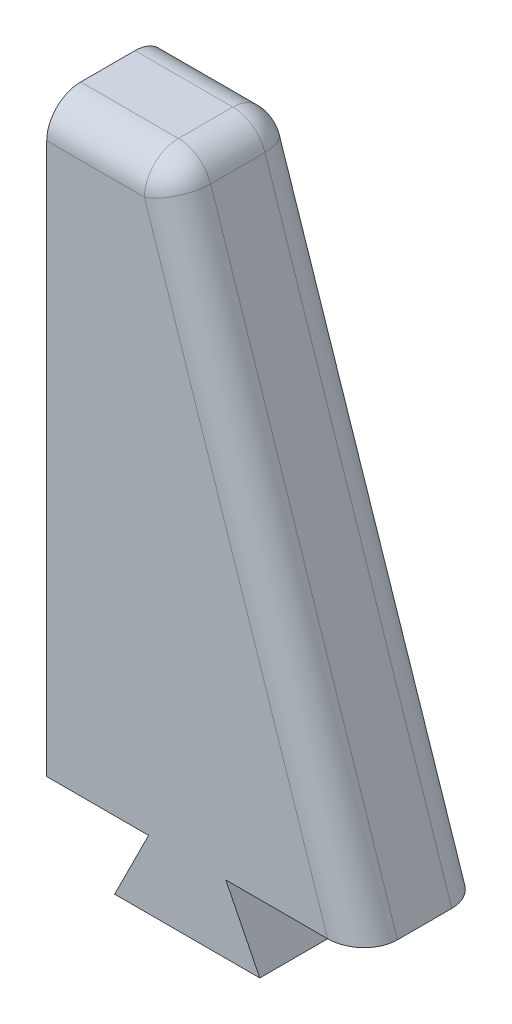
ISO-10303-21;
HEADER;
FILE_DESCRIPTION(('STEP AP214'),'2;1');
FILE_NAME('part.step','',(''),(''),'','','');
FILE_SCHEMA(('AUTOMOTIVE_DESIGN { 1 0 10303 214 1 1 1 1 }'));
ENDSEC;
DATA;
#1=APPLICATION_CONTEXT('core data for automotive mechanical design processes');
#2=APPLICATION_PROTOCOL_DEFINITION('international standard','automotive_design',2000,#1);
#3=PRODUCT_CONTEXT('',#1,'mechanical');
#4=PRODUCT('Part','Part','',(#3));
#5=PRODUCT_RELATED_PRODUCT_CATEGORY('part','',(#4));
#6=PRODUCT_DEFINITION_FORMATION('','',#4);
#7=PRODUCT_DEFINITION_CONTEXT('part definition',#1,'design');
#8=PRODUCT_DEFINITION('design','',#6,#7);
#9=PRODUCT_DEFINITION_SHAPE('','',#8);
#10=(LENGTH_UNIT() NAMED_UNIT(*) SI_UNIT(.MILLI.,.METRE.));
#11=(NAMED_UNIT(*) PLANE_ANGLE_UNIT() SI_UNIT($,.RADIAN.));
#12=(NAMED_UNIT(*) SI_UNIT($,.STERADIAN.) SOLID_ANGLE_UNIT());
#13=UNCERTAINTY_MEASURE_WITH_UNIT(LENGTH_MEASURE(1.E-05),#10,'distance_accuracy_value','');
#14=(GEOMETRIC_REPRESENTATION_CONTEXT(3) GLOBAL_UNCERTAINTY_ASSIGNED_CONTEXT((#13)) GLOBAL_UNIT_ASSIGNED_CONTEXT((#10,
#11,#12)) REPRESENTATION_CONTEXT('',''));
#15=CARTESIAN_POINT('',(0.,0.,0.));
#16=DIRECTION('',(0.,0.,1.));
#17=DIRECTION('',(1.,0.,0.));
#18=AXIS2_PLACEMENT_3D('',#15,#16,#17);
#19=CARTESIAN_POINT('',(120.,241.333333333333,179.666666666667));
#20=DIRECTION('',(0.,0.,-1.));
#21=DIRECTION('',(0.,1.,0.));
#22=AXIS2_PLACEMENT_3D('',#19,#20,#21);
#23=PLANE('',#22);
#24=DIRECTION('',(-0.447213595499958,-0.894427190999916,0.));
#25=VECTOR('',#24,1.);
#26=CARTESIAN_POINT('',(-50.0961543910256,25.0480771955128,179.666666666667));
#27=LINE('',#26,#25);
#28=CARTESIAN_POINT('',(15.,155.240385977564,179.666666666667));
#29=VERTEX_POINT('',#28);
#30=CARTESIAN_POINT('',(9.99999999999999,145.240385977564,179.666666666667));
#31=VERTEX_POINT('',#30);
#32=EDGE_CURVE('E148',#29,#31,#27,.T.);
#33=ORIENTED_EDGE('',*,*,#32,.T.);
#34=DIRECTION('',(1.,0.,0.));
#35=VECTOR('',#34,1.);
#36=CARTESIAN_POINT('',(0.,145.240385977564,179.666666666667));
#37=LINE('',#36,#35);
#38=CARTESIAN_POINT('',(31.3812304139478,145.240385977564,179.666666666667));
#39=VERTEX_POINT('',#38);
#40=EDGE_CURVE('E180',#31,#39,#37,.T.);
#41=ORIENTED_EDGE('',*,*,#40,.T.);
#42=DIRECTION('',(-0.447213595499957,0.894427190999916,0.));
#43=VECTOR('',#42,1.);
#44=CARTESIAN_POINT('',(83.2011387221838,41.6005693610918,179.666666666667));
#45=LINE('',#44,#43);
#46=CARTESIAN_POINT('',(26.3812304139478,155.240385977564,179.666666666667));
#47=VERTEX_POINT('',#46);
#48=EDGE_CURVE('E63',#39,#47,#45,.T.);
#49=ORIENTED_EDGE('',*,*,#48,.T.);
#50=DIRECTION('',(-1.,0.,0.));
#51=VECTOR('',#50,1.);
#52=CARTESIAN_POINT('',(-2.87252418106646E-13,155.240385977564,179.666666666667));
#53=LINE('',#52,#51);
#54=CARTESIAN_POINT('',(41.3812304139478,155.240385977564,179.666666666667));
#55=VERTEX_POINT('',#54);
#56=EDGE_CURVE('E169',#55,#47,#53,.T.);
#57=ORIENTED_EDGE('',*,*,#56,.F.);
#58=DIRECTION('',(0.315763370237404,-0.94883797037024,0.));
#59=VECTOR('',#58,1.);
#60=CARTESIAN_POINT('',(23.4258737584846,209.194472398147,179.666666666667));
#61=LINE('',#60,#59);
#62=CARTESIAN_POINT('',(14.394344181359,236.333333333333,179.666666666667));
#63=VERTEX_POINT('',#62);
#64=EDGE_CURVE('E203',#55,#63,#61,.F.);
#65=ORIENTED_EDGE('',*,*,#64,.T.);
#66=DIRECTION('',(-1.,0.,0.));
#67=VECTOR('',#66,1.);
#68=CARTESIAN_POINT('',(120.,236.333333333333,179.666666666667));
#69=LINE('',#68,#67);
#70=CARTESIAN_POINT('',(0.,236.333333333333,179.666666666667));
#71=VERTEX_POINT('',#70);
#72=EDGE_CURVE('E201',#63,#71,#69,.T.);
#73=ORIENTED_EDGE('',*,*,#72,.T.);
#74=DIRECTION('',(0.,-1.,0.));
#75=VECTOR('',#74,1.);
#76=CARTESIAN_POINT('',(0.,241.333333333333,179.666666666667));
#77=LINE('',#76,#75);
#78=CARTESIAN_POINT('',(0.,155.240385977564,179.666666666667));
#79=VERTEX_POINT('',#78);
#80=EDGE_CURVE('E188',#71,#79,#77,.T.);
#81=ORIENTED_EDGE('',*,*,#80,.T.);
#82=DIRECTION('',(1.,0.,0.));
#83=VECTOR('',#82,1.);
#84=CARTESIAN_POINT('',(0.,155.240385977564,179.666666666667));
#85=LINE('',#84,#83);
#86=EDGE_CURVE('E156',#79,#29,#85,.T.);
#87=ORIENTED_EDGE('',*,*,#86,.T.);
#88=EDGE_LOOP('',(#33,#41,#49,#57,#65,#73,#81,#87));
#89=FACE_BOUND('',#88,.T.);
#90=ADVANCED_FACE('F48',(#89),#23,.F.);
#91=CARTESIAN_POINT('',(120.,-65.1666666666666,161.666666666667));
#92=DIRECTION('',(0.,0.,1.));
#93=DIRECTION('',(0.,-1.,0.));
#94=AXIS2_PLACEMENT_3D('',#91,#92,#93);
#95=PLANE('',#94);
#96=DIRECTION('',(-0.447213595499958,-0.894427190999916,0.));
#97=VECTOR('',#96,1.);
#98=CARTESIAN_POINT('',(-50.0961543910256,25.0480771955128,161.666666666667));
#99=LINE('',#98,#97);
#100=CARTESIAN_POINT('',(15.,155.240385977564,161.666666666667));
#101=VERTEX_POINT('',#100);
#102=CARTESIAN_POINT('',(9.99999999999999,145.240385977564,161.666666666667));
#103=VERTEX_POINT('',#102);
#104=EDGE_CURVE('E71',#101,#103,#99,.T.);
#105=ORIENTED_EDGE('',*,*,#104,.F.);
#106=DIRECTION('',(1.,0.,0.));
#107=VECTOR('',#106,1.);
#108=CARTESIAN_POINT('',(0.,155.240385977564,161.666666666667));
#109=LINE('',#108,#107);
#110=CARTESIAN_POINT('',(0.,155.240385977564,161.666666666667));
#111=VERTEX_POINT('',#110);
#112=EDGE_CURVE('E137',#111,#101,#109,.T.);
#113=ORIENTED_EDGE('',*,*,#112,.F.);
#114=DIRECTION('',(0.,1.,0.));
#115=VECTOR('',#114,1.);
#116=CARTESIAN_POINT('',(0.,-65.1666666666666,161.666666666667));
#117=LINE('',#116,#115);
#118=CARTESIAN_POINT('',(0.,236.333333333333,161.666666666667));
#119=VERTEX_POINT('',#118);
#120=EDGE_CURVE('E192',#111,#119,#117,.T.);
#121=ORIENTED_EDGE('',*,*,#120,.T.);
#122=DIRECTION('',(-1.,0.,0.));
#123=VECTOR('',#122,1.);
#124=CARTESIAN_POINT('',(120.,236.333333333333,161.666666666667));
#125=LINE('',#124,#123);
#126=CARTESIAN_POINT('',(14.394344181359,236.333333333333,161.666666666667));
#127=VERTEX_POINT('',#126);
#128=EDGE_CURVE('E205',#119,#127,#125,.F.);
#129=ORIENTED_EDGE('',*,*,#128,.T.);
#130=DIRECTION('',(0.315763370237404,-0.94883797037024,0.));
#131=VECTOR('',#130,1.);
#132=CARTESIAN_POINT('',(115.255810148149,-66.7454835178537,161.666666666667));
#133=LINE('',#132,#131);
#134=CARTESIAN_POINT('',(41.3812304139478,155.240385977564,161.666666666667));
#135=VERTEX_POINT('',#134);
#136=EDGE_CURVE('E207',#127,#135,#133,.T.);
#137=ORIENTED_EDGE('',*,*,#136,.T.);
#138=DIRECTION('',(-1.,0.,0.));
#139=VECTOR('',#138,1.);
#140=CARTESIAN_POINT('',(-2.87252418106646E-13,155.240385977564,161.666666666667));
#141=LINE('',#140,#139);
#142=CARTESIAN_POINT('',(26.3812304139478,155.240385977564,161.666666666667));
#143=VERTEX_POINT('',#142);
#144=EDGE_CURVE('E168',#135,#143,#141,.T.);
#145=ORIENTED_EDGE('',*,*,#144,.T.);
#146=DIRECTION('',(-0.447213595499957,0.894427190999916,0.));
#147=VECTOR('',#146,1.);
#148=CARTESIAN_POINT('',(83.2011387221838,41.6005693610918,161.666666666667));
#149=LINE('',#148,#147);
#150=CARTESIAN_POINT('',(31.3812304139478,145.240385977564,161.666666666667));
#151=VERTEX_POINT('',#150);
#152=EDGE_CURVE('E166',#151,#143,#149,.T.);
#153=ORIENTED_EDGE('',*,*,#152,.F.);
#154=DIRECTION('',(1.,0.,0.));
#155=VECTOR('',#154,1.);
#156=CARTESIAN_POINT('',(120.,145.240385977564,161.666666666667));
#157=LINE('',#156,#155);
#158=EDGE_CURVE('E155',#103,#151,#157,.T.);
#159=ORIENTED_EDGE('',*,*,#158,.F.);
#160=EDGE_LOOP('',(#105,#113,#121,#129,#137,#145,#153,#159));
#161=FACE_BOUND('',#160,.T.);
#162=ADVANCED_FACE('F152',(#161),#95,.F.);
#163=CARTESIAN_POINT('',(0.,0.,0.));
#164=DIRECTION('',(1.,0.,0.));
#165=DIRECTION('',(0.,0.,-1.));
#166=AXIS2_PLACEMENT_3D('',#163,#164,#165);
#167=PLANE('',#166);
#168=DIRECTION('',(0.,0.,1.));
#169=VECTOR('',#168,1.);
#170=CARTESIAN_POINT('',(0.,155.240385977564,161.666666666667));
#171=LINE('',#170,#169);
#172=EDGE_CURVE('E142',#111,#79,#171,.T.);
#173=ORIENTED_EDGE('',*,*,#172,.T.);
#174=ORIENTED_EDGE('',*,*,#80,.F.);
#175=CARTESIAN_POINT('',(0.,236.333333333333,174.666666666667));
#176=DIRECTION('',(1.,0.,0.));
#177=DIRECTION('',(0.,0.,-1.));
#178=AXIS2_PLACEMENT_3D('',#175,#176,#177);
#179=CIRCLE('',#178,5.);
#180=CARTESIAN_POINT('',(0.,241.333333333333,174.666666666667));
#181=VERTEX_POINT('',#180);
#182=EDGE_CURVE('E216',#71,#181,#179,.F.);
#183=ORIENTED_EDGE('',*,*,#182,.T.);
#184=DIRECTION('',(0.,0.,1.));
#185=VECTOR('',#184,1.);
#186=CARTESIAN_POINT('',(0.,241.333333333333,161.666666666667));
#187=LINE('',#186,#185);
#188=CARTESIAN_POINT('',(0.,241.333333333333,166.666666666667));
#189=VERTEX_POINT('',#188);
#190=EDGE_CURVE('E185',#189,#181,#187,.T.);
#191=ORIENTED_EDGE('',*,*,#190,.F.);
#192=CARTESIAN_POINT('',(0.,236.333333333333,166.666666666667));
#193=DIRECTION('',(1.,0.,0.));
#194=DIRECTION('',(0.,0.,-1.));
#195=AXIS2_PLACEMENT_3D('',#192,#193,#194);
#196=CIRCLE('',#195,5.);
#197=EDGE_CURVE('E56',#189,#119,#196,.F.);
#198=ORIENTED_EDGE('',*,*,#197,.T.);
#199=ORIENTED_EDGE('',*,*,#120,.F.);
#200=EDGE_LOOP('',(#173,#174,#183,#191,#198,#199));
#201=FACE_BOUND('',#200,.T.);
#202=ADVANCED_FACE('F261',(#201),#167,.F.);
#203=CARTESIAN_POINT('',(0.,145.240385977564,-59.3333333333335));
#204=DIRECTION('',(0.,-1.,0.));
#205=DIRECTION('',(0.,0.,-1.));
#206=AXIS2_PLACEMENT_3D('',#203,#204,#205);
#207=PLANE('',#206);
#208=ORIENTED_EDGE('',*,*,#40,.F.);
#209=DIRECTION('',(0.,0.,1.));
#210=VECTOR('',#209,1.);
#211=CARTESIAN_POINT('',(9.99999999999999,145.240385977564,161.666666666667));
#212=LINE('',#211,#210);
#213=EDGE_CURVE('E162',#103,#31,#212,.T.);
#214=ORIENTED_EDGE('',*,*,#213,.F.);
#215=ORIENTED_EDGE('',*,*,#158,.T.);
#216=DIRECTION('',(0.,0.,1.));
#217=VECTOR('',#216,1.);
#218=CARTESIAN_POINT('',(31.3812304139478,145.240385977564,161.666666666667));
#219=LINE('',#218,#217);
#220=EDGE_CURVE('E172',#151,#39,#219,.T.);
#221=ORIENTED_EDGE('',*,*,#220,.T.);
#222=EDGE_LOOP('',(#208,#214,#215,#221));
#223=FACE_BOUND('',#222,.T.);
#224=ADVANCED_FACE('F283',(#223),#207,.T.);
#225=CARTESIAN_POINT('',(88.5107466727362,29.4554524000623,139.666666666667));
#226=DIRECTION('',(-0.94883797037024,-0.315763370237404,0.));
#227=DIRECTION('',(0.315763370237404,-0.94883797037024,0.));
#228=AXIS2_PLACEMENT_3D('',#225,#226,#227);
#229=PLANE('',#228);
#230=DIRECTION('',(0.315763370237404,-0.94883797037024,0.));
#231=VECTOR('',#230,1.);
#232=CARTESIAN_POINT('',(88.5107466727362,29.4554524000623,174.666666666667));
#233=LINE('',#232,#231);
#234=CARTESIAN_POINT('',(19.1385340332102,237.91215018452,174.666666666667));
#235=VERTEX_POINT('',#234);
#236=CARTESIAN_POINT('',(46.650834030305,155.240385977564,174.666666666667));
#237=VERTEX_POINT('',#236);
#238=EDGE_CURVE('E198',#235,#237,#233,.T.);
#239=ORIENTED_EDGE('',*,*,#238,.T.);
#240=DIRECTION('',(0.,0.,1.));
#241=VECTOR('',#240,1.);
#242=CARTESIAN_POINT('',(46.650834030305,155.240385977564,161.666666666667));
#243=LINE('',#242,#241);
#244=CARTESIAN_POINT('',(46.650834030305,155.240385977564,166.666666666667));
#245=VERTEX_POINT('',#244);
#246=EDGE_CURVE('E176',#245,#237,#243,.T.);
#247=ORIENTED_EDGE('',*,*,#246,.F.);
#248=DIRECTION('',(0.315763370237404,-0.94883797037024,0.));
#249=VECTOR('',#248,1.);
#250=CARTESIAN_POINT('',(88.5107466727362,29.4554524000623,166.666666666667));
#251=LINE('',#250,#249);
#252=CARTESIAN_POINT('',(19.1385340332102,237.91215018452,166.666666666667));
#253=VERTEX_POINT('',#252);
#254=EDGE_CURVE('E196',#245,#253,#251,.F.);
#255=ORIENTED_EDGE('',*,*,#254,.T.);
#256=DIRECTION('',(0.,0.,1.));
#257=VECTOR('',#256,1.);
#258=CARTESIAN_POINT('',(19.1385340332102,237.91215018452,139.666666666667));
#259=LINE('',#258,#257);
#260=EDGE_CURVE('E194',#253,#235,#259,.T.);
#261=ORIENTED_EDGE('',*,*,#260,.T.);
#262=EDGE_LOOP('',(#239,#247,#255,#261));
#263=FACE_BOUND('',#262,.T.);
#264=ADVANCED_FACE('F250',(#263),#229,.F.);
#265=CARTESIAN_POINT('',(115.255810148149,-66.7454835178537,166.666666666667));
#266=DIRECTION('',(0.315763370237404,-0.94883797037024,0.));
#267=DIRECTION('',(0.94883797037024,0.315763370237404,0.));
#268=AXIS2_PLACEMENT_3D('',#265,#266,#267);
#269=CYLINDRICAL_SURFACE('',#268,5.);
#270=CARTESIAN_POINT('',(41.3812304139478,155.240385977564,166.666666666667));
#271=DIRECTION('',(0.,1.,0.));
#272=DIRECTION('',(1.,0.,0.));
#273=AXIS2_PLACEMENT_3D('',#270,#271,#272);
#274=ELLIPSE('',#273,5.26960361635715,5.);
#275=EDGE_CURVE('E164',#135,#245,#274,.F.);
#276=ORIENTED_EDGE('',*,*,#275,.F.);
#277=ORIENTED_EDGE('',*,*,#136,.F.);
#278=CARTESIAN_POINT('',(14.394344181359,236.333333333333,166.666666666667));
#279=DIRECTION('',(-0.315763370237404,0.94883797037024,0.));
#280=DIRECTION('',(-0.94883797037024,-0.315763370237404,0.));
#281=AXIS2_PLACEMENT_3D('',#278,#279,#280);
#282=CIRCLE('',#281,5.);
#283=EDGE_CURVE('E231',#253,#127,#282,.T.);
#284=ORIENTED_EDGE('',*,*,#283,.F.);
#285=ORIENTED_EDGE('',*,*,#254,.F.);
#286=EDGE_LOOP('',(#276,#277,#284,#285));
#287=FACE_BOUND('',#286,.T.);
#288=ADVANCED_FACE('F257',(#287),#269,.T.);
#289=CARTESIAN_POINT('',(83.766556820885,27.8766355488753,174.666666666667));
#290=DIRECTION('',(0.315763370237404,-0.94883797037024,0.));
#291=DIRECTION('',(0.94883797037024,0.315763370237404,0.));
#292=AXIS2_PLACEMENT_3D('',#289,#290,#291);
#293=CYLINDRICAL_SURFACE('',#292,5.);
#294=CARTESIAN_POINT('',(41.3812304139478,155.240385977564,174.666666666667));
#295=DIRECTION('',(0.,1.,0.));
#296=DIRECTION('',(1.,0.,0.));
#297=AXIS2_PLACEMENT_3D('',#294,#295,#296);
#298=ELLIPSE('',#297,5.26960361635715,5.);
#299=EDGE_CURVE('E11',#237,#55,#298,.F.);
#300=ORIENTED_EDGE('',*,*,#299,.F.);
#301=ORIENTED_EDGE('',*,*,#238,.F.);
#302=CARTESIAN_POINT('',(14.394344181359,236.333333333333,174.666666666667));
#303=DIRECTION('',(-0.315763370237404,0.94883797037024,0.));
#304=DIRECTION('',(-0.94883797037024,-0.315763370237404,0.));
#305=AXIS2_PLACEMENT_3D('',#302,#303,#304);
#306=CIRCLE('',#305,5.);
#307=EDGE_CURVE('E184',#235,#63,#306,.F.);
#308=ORIENTED_EDGE('',*,*,#307,.T.);
#309=ORIENTED_EDGE('',*,*,#64,.F.);
#310=EDGE_LOOP('',(#300,#301,#308,#309));
#311=FACE_BOUND('',#310,.T.);
#312=ADVANCED_FACE('F275',(#311),#293,.T.);
#313=CARTESIAN_POINT('',(120.,241.333333333333,161.666666666667));
#314=DIRECTION('',(0.,-1.,0.));
#315=DIRECTION('',(0.,0.,-1.));
#316=AXIS2_PLACEMENT_3D('',#313,#314,#315);
#317=PLANE('',#316);
#318=DIRECTION('',(0.,0.,1.));
#319=VECTOR('',#318,1.);
#320=CARTESIAN_POINT('',(14.394344181359,241.333333333333,161.666666666667));
#321=LINE('',#320,#319);
#322=CARTESIAN_POINT('',(14.394344181359,241.333333333333,174.666666666667));
#323=VERTEX_POINT('',#322);
#324=CARTESIAN_POINT('',(14.394344181359,241.333333333333,166.666666666667));
#325=VERTEX_POINT('',#324);
#326=EDGE_CURVE('E212',#323,#325,#321,.F.);
#327=ORIENTED_EDGE('',*,*,#326,.T.);
#328=DIRECTION('',(-1.,0.,0.));
#329=VECTOR('',#328,1.);
#330=CARTESIAN_POINT('',(120.,241.333333333333,166.666666666667));
#331=LINE('',#330,#329);
#332=EDGE_CURVE('E214',#325,#189,#331,.T.);
#333=ORIENTED_EDGE('',*,*,#332,.T.);
#334=ORIENTED_EDGE('',*,*,#190,.T.);
#335=DIRECTION('',(-1.,0.,0.));
#336=VECTOR('',#335,1.);
#337=CARTESIAN_POINT('',(120.,241.333333333333,174.666666666667));
#338=LINE('',#337,#336);
#339=EDGE_CURVE('E210',#181,#323,#338,.F.);
#340=ORIENTED_EDGE('',*,*,#339,.T.);
#341=EDGE_LOOP('',(#327,#333,#334,#340));
#342=FACE_BOUND('',#341,.T.);
#343=ADVANCED_FACE('F266',(#342),#317,.F.);
#344=CARTESIAN_POINT('',(120.,236.333333333333,166.666666666667));
#345=DIRECTION('',(-1.,0.,0.));
#346=DIRECTION('',(0.,0.,1.));
#347=AXIS2_PLACEMENT_3D('',#344,#345,#346);
#348=CYLINDRICAL_SURFACE('',#347,5.);
#349=ORIENTED_EDGE('',*,*,#197,.F.);
#350=ORIENTED_EDGE('',*,*,#332,.F.);
#351=CARTESIAN_POINT('',(14.394344181359,236.333333333333,166.666666666667));
#352=DIRECTION('',(1.,0.,0.));
#353=DIRECTION('',(0.,1.,0.));
#354=AXIS2_PLACEMENT_3D('',#351,#352,#353);
#355=CIRCLE('',#354,5.);
#356=EDGE_CURVE('E189',#127,#325,#355,.T.);
#357=ORIENTED_EDGE('',*,*,#356,.F.);
#358=ORIENTED_EDGE('',*,*,#128,.F.);
#359=EDGE_LOOP('',(#349,#350,#357,#358));
#360=FACE_BOUND('',#359,.T.);
#361=ADVANCED_FACE('F50',(#360),#348,.T.);
#362=CARTESIAN_POINT('',(14.394344181359,236.333333333333,166.666666666667));
#363=DIRECTION('',(0.,0.,-1.));
#364=DIRECTION('',(-1.,0.,0.));
#365=AXIS2_PLACEMENT_3D('',#362,#363,#364);
#366=SPHERICAL_SURFACE('',#365,5.);
#367=ORIENTED_EDGE('',*,*,#283,.T.);
#368=ORIENTED_EDGE('',*,*,#356,.T.);
#369=CARTESIAN_POINT('',(14.394344181359,236.333333333333,166.666666666667));
#370=DIRECTION('',(0.,0.,-1.));
#371=DIRECTION('',(-1.,0.,0.));
#372=AXIS2_PLACEMENT_3D('',#369,#370,#371);
#373=CIRCLE('',#372,5.);
#374=EDGE_CURVE('E228',#253,#325,#373,.F.);
#375=ORIENTED_EDGE('',*,*,#374,.F.);
#376=EDGE_LOOP('',(#367,#368,#375));
#377=FACE_BOUND('',#376,.T.);
#378=ADVANCED_FACE('F237',(#377),#366,.T.);
#379=CARTESIAN_POINT('',(120.,236.333333333333,174.666666666667));
#380=DIRECTION('',(-1.,0.,0.));
#381=DIRECTION('',(0.,0.,1.));
#382=AXIS2_PLACEMENT_3D('',#379,#380,#381);
#383=CYLINDRICAL_SURFACE('',#382,5.);
#384=ORIENTED_EDGE('',*,*,#182,.F.);
#385=ORIENTED_EDGE('',*,*,#72,.F.);
#386=CARTESIAN_POINT('',(14.394344181359,236.333333333333,174.666666666667));
#387=DIRECTION('',(1.,0.,0.));
#388=DIRECTION('',(0.,0.,-1.));
#389=AXIS2_PLACEMENT_3D('',#386,#387,#388);
#390=CIRCLE('',#389,5.);
#391=EDGE_CURVE('E225',#323,#63,#390,.T.);
#392=ORIENTED_EDGE('',*,*,#391,.F.);
#393=ORIENTED_EDGE('',*,*,#339,.F.);
#394=EDGE_LOOP('',(#384,#385,#392,#393));
#395=FACE_BOUND('',#394,.T.);
#396=ADVANCED_FACE('F268',(#395),#383,.T.);
#397=CARTESIAN_POINT('',(14.394344181359,236.333333333333,139.666666666667));
#398=DIRECTION('',(0.,0.,1.));
#399=DIRECTION('',(0.,-1.,0.));
#400=AXIS2_PLACEMENT_3D('',#397,#398,#399);
#401=CYLINDRICAL_SURFACE('',#400,5.);
#402=ORIENTED_EDGE('',*,*,#374,.T.);
#403=ORIENTED_EDGE('',*,*,#326,.F.);
#404=CARTESIAN_POINT('',(14.394344181359,236.333333333333,174.666666666667));
#405=DIRECTION('',(0.,0.,1.));
#406=DIRECTION('',(1.,0.,0.));
#407=AXIS2_PLACEMENT_3D('',#404,#405,#406);
#408=CIRCLE('',#407,5.);
#409=EDGE_CURVE('E222',#235,#323,#408,.T.);
#410=ORIENTED_EDGE('',*,*,#409,.F.);
#411=ORIENTED_EDGE('',*,*,#260,.F.);
#412=EDGE_LOOP('',(#402,#403,#410,#411));
#413=FACE_BOUND('',#412,.T.);
#414=ADVANCED_FACE('F245',(#413),#401,.T.);
#415=CARTESIAN_POINT('',(14.394344181359,236.333333333333,174.666666666667));
#416=DIRECTION('',(0.,0.,1.));
#417=DIRECTION('',(1.,0.,0.));
#418=AXIS2_PLACEMENT_3D('',#415,#416,#417);
#419=SPHERICAL_SURFACE('',#418,5.);
#420=ORIENTED_EDGE('',*,*,#409,.T.);
#421=ORIENTED_EDGE('',*,*,#391,.T.);
#422=ORIENTED_EDGE('',*,*,#307,.F.);
#423=EDGE_LOOP('',(#420,#421,#422));
#424=FACE_BOUND('',#423,.T.);
#425=ADVANCED_FACE('F271',(#424),#419,.T.);
#426=CARTESIAN_POINT('',(83.2011387221838,41.6005693610918,161.666666666667));
#427=DIRECTION('',(0.894427190999916,0.447213595499957,0.));
#428=DIRECTION('',(-0.447213595499957,0.894427190999916,0.));
#429=AXIS2_PLACEMENT_3D('',#426,#427,#428);
#430=PLANE('',#429);
#431=ORIENTED_EDGE('',*,*,#48,.F.);
#432=ORIENTED_EDGE('',*,*,#220,.F.);
#433=ORIENTED_EDGE('',*,*,#152,.T.);
#434=DIRECTION('',(0.,0.,1.));
#435=VECTOR('',#434,1.);
#436=CARTESIAN_POINT('',(26.3812304139478,155.240385977564,161.666666666667));
#437=LINE('',#436,#435);
#438=EDGE_CURVE('E160',#143,#47,#437,.T.);
#439=ORIENTED_EDGE('',*,*,#438,.T.);
#440=EDGE_LOOP('',(#431,#432,#433,#439));
#441=FACE_BOUND('',#440,.T.);
#442=ADVANCED_FACE('F284',(#441),#430,.T.);
#443=CARTESIAN_POINT('',(-2.87252418106646E-13,155.240385977564,161.666666666667));
#444=DIRECTION('',(0.,1.,0.));
#445=DIRECTION('',(-1.,0.,0.));
#446=AXIS2_PLACEMENT_3D('',#443,#444,#445);
#447=PLANE('',#446);
#448=ORIENTED_EDGE('',*,*,#275,.T.);
#449=ORIENTED_EDGE('',*,*,#246,.T.);
#450=ORIENTED_EDGE('',*,*,#299,.T.);
#451=ORIENTED_EDGE('',*,*,#56,.T.);
#452=ORIENTED_EDGE('',*,*,#438,.F.);
#453=ORIENTED_EDGE('',*,*,#144,.F.);
#454=EDGE_LOOP('',(#448,#449,#450,#451,#452,#453));
#455=FACE_BOUND('',#454,.T.);
#456=ADVANCED_FACE('F278',(#455),#447,.F.);
#457=CARTESIAN_POINT('',(-50.0961543910256,25.0480771955128,161.666666666667));
#458=DIRECTION('',(-0.894427190999916,0.447213595499958,0.));
#459=DIRECTION('',(-0.447213595499958,-0.894427190999916,0.));
#460=AXIS2_PLACEMENT_3D('',#457,#458,#459);
#461=PLANE('',#460);
#462=ORIENTED_EDGE('',*,*,#32,.F.);
#463=DIRECTION('',(0.,0.,1.));
#464=VECTOR('',#463,1.);
#465=CARTESIAN_POINT('',(15.,155.240385977564,161.666666666667));
#466=LINE('',#465,#464);
#467=EDGE_CURVE('E139',#101,#29,#466,.T.);
#468=ORIENTED_EDGE('',*,*,#467,.F.);
#469=ORIENTED_EDGE('',*,*,#104,.T.);
#470=ORIENTED_EDGE('',*,*,#213,.T.);
#471=EDGE_LOOP('',(#462,#468,#469,#470));
#472=FACE_BOUND('',#471,.T.);
#473=ADVANCED_FACE('F146',(#472),#461,.T.);
#474=CARTESIAN_POINT('',(0.,155.240385977564,161.666666666667));
#475=DIRECTION('',(0.,-1.,0.));
#476=DIRECTION('',(0.,0.,-1.));
#477=AXIS2_PLACEMENT_3D('',#474,#475,#476);
#478=PLANE('',#477);
#479=ORIENTED_EDGE('',*,*,#86,.F.);
#480=ORIENTED_EDGE('',*,*,#172,.F.);
#481=ORIENTED_EDGE('',*,*,#112,.T.);
#482=ORIENTED_EDGE('',*,*,#467,.T.);
#483=EDGE_LOOP('',(#479,#480,#481,#482));
#484=FACE_BOUND('',#483,.T.);
#485=ADVANCED_FACE('F138',(#484),#478,.T.);
#486=CLOSED_SHELL('',(#90,#162,#202,#224,#264,#288,#312,#343,#361,#378,#396,#414,#425,#442,#456,
#473,#485));
#487=MANIFOLD_SOLID_BREP('B2',#486);
#488=ADVANCED_BREP_SHAPE_REPRESENTATION('',(#18,#487),#14);
#489=SHAPE_DEFINITION_REPRESENTATION(#9,#488);
ENDSEC;
END-ISO-10303-21;
